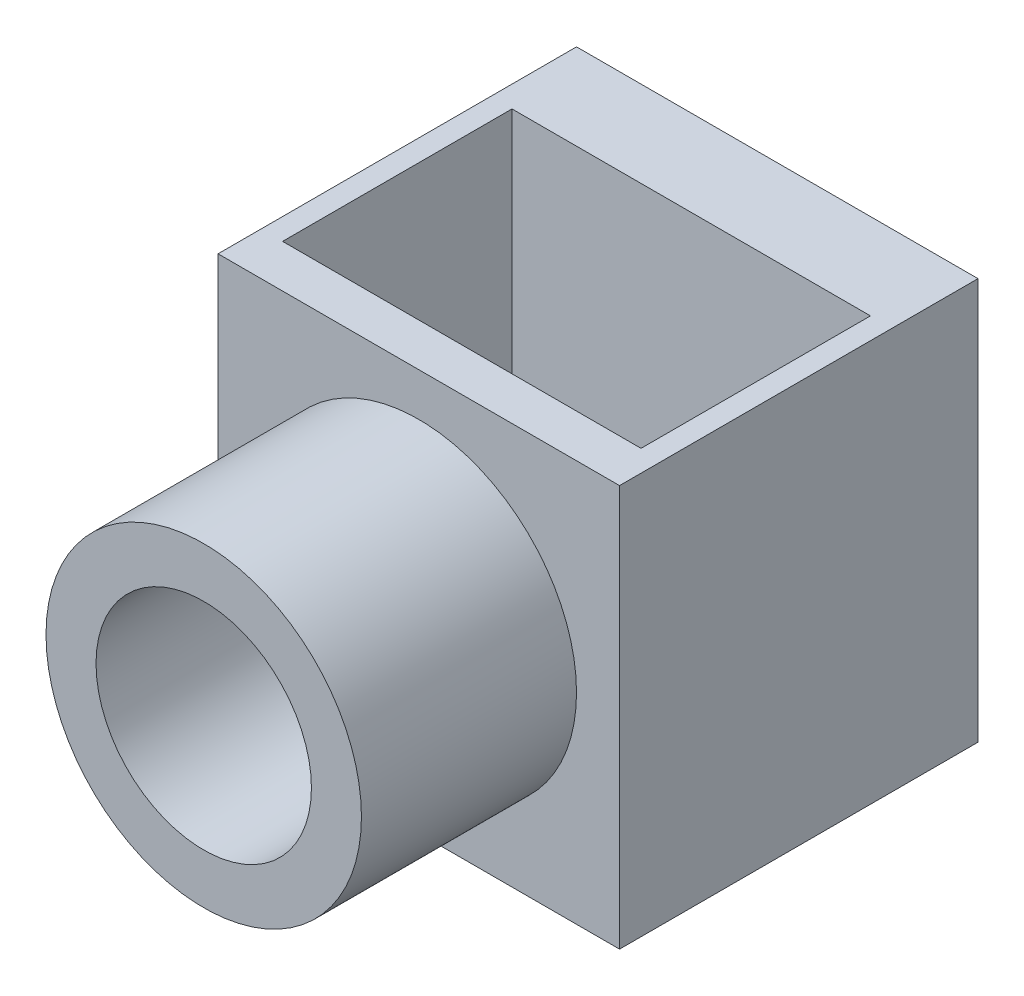
ISO-10303-21;
HEADER;
FILE_DESCRIPTION(('STEP AP214'),'2;1');
FILE_NAME('part.step','',(''),(''),'','','');
FILE_SCHEMA(('AUTOMOTIVE_DESIGN { 1 0 10303 214 1 1 1 1 }'));
ENDSEC;
DATA;
#1=APPLICATION_CONTEXT('core data for automotive mechanical design processes');
#2=APPLICATION_PROTOCOL_DEFINITION('international standard','automotive_design',2000,#1);
#3=PRODUCT_CONTEXT('',#1,'mechanical');
#4=PRODUCT('Part','Part','',(#3));
#5=PRODUCT_RELATED_PRODUCT_CATEGORY('part','',(#4));
#6=PRODUCT_DEFINITION_FORMATION('','',#4);
#7=PRODUCT_DEFINITION_CONTEXT('part definition',#1,'design');
#8=PRODUCT_DEFINITION('design','',#6,#7);
#9=PRODUCT_DEFINITION_SHAPE('','',#8);
#10=(LENGTH_UNIT() NAMED_UNIT(*) SI_UNIT(.MILLI.,.METRE.));
#11=(NAMED_UNIT(*) PLANE_ANGLE_UNIT() SI_UNIT($,.RADIAN.));
#12=(NAMED_UNIT(*) SI_UNIT($,.STERADIAN.) SOLID_ANGLE_UNIT());
#13=UNCERTAINTY_MEASURE_WITH_UNIT(LENGTH_MEASURE(1.E-05),#10,'distance_accuracy_value','');
#14=(GEOMETRIC_REPRESENTATION_CONTEXT(3) GLOBAL_UNCERTAINTY_ASSIGNED_CONTEXT((#13)) GLOBAL_UNIT_ASSIGNED_CONTEXT((#10,
#11,#12)) REPRESENTATION_CONTEXT('',''));
#15=CARTESIAN_POINT('',(0.,0.,0.));
#16=DIRECTION('',(0.,0.,1.));
#17=DIRECTION('',(1.,0.,0.));
#18=AXIS2_PLACEMENT_3D('',#15,#16,#17);
#19=CARTESIAN_POINT('',(0.,7.112,0.));
#20=DIRECTION('',(1.,0.,0.));
#21=DIRECTION('',(0.,0.,-1.));
#22=AXIS2_PLACEMENT_3D('',#19,#20,#21);
#23=PLANE('',#22);
#24=DIRECTION('',(0.,0.,1.));
#25=VECTOR('',#24,1.);
#26=CARTESIAN_POINT('',(0.,0.,0.));
#27=LINE('',#26,#25);
#28=CARTESIAN_POINT('',(0.,0.,-6.35));
#29=VERTEX_POINT('',#28);
#30=CARTESIAN_POINT('',(0.,0.,0.));
#31=VERTEX_POINT('',#30);
#32=EDGE_CURVE('E159',#29,#31,#27,.T.);
#33=ORIENTED_EDGE('',*,*,#32,.T.);
#34=DIRECTION('',(0.,-1.,0.));
#35=VECTOR('',#34,1.);
#36=CARTESIAN_POINT('',(0.,7.112,0.));
#37=LINE('',#36,#35);
#38=CARTESIAN_POINT('',(0.,7.112,0.));
#39=VERTEX_POINT('',#38);
#40=EDGE_CURVE('E42',#39,#31,#37,.T.);
#41=ORIENTED_EDGE('',*,*,#40,.F.);
#42=DIRECTION('',(0.,0.,1.));
#43=VECTOR('',#42,1.);
#44=CARTESIAN_POINT('',(0.,7.112,0.));
#45=LINE('',#44,#43);
#46=CARTESIAN_POINT('',(0.,7.112,-6.35));
#47=VERTEX_POINT('',#46);
#48=EDGE_CURVE('E152',#47,#39,#45,.T.);
#49=ORIENTED_EDGE('',*,*,#48,.F.);
#50=DIRECTION('',(0.,-1.,0.));
#51=VECTOR('',#50,1.);
#52=CARTESIAN_POINT('',(0.,7.112,-6.35));
#53=LINE('',#52,#51);
#54=EDGE_CURVE('E158',#47,#29,#53,.T.);
#55=ORIENTED_EDGE('',*,*,#54,.T.);
#56=EDGE_LOOP('',(#33,#41,#49,#55));
#57=FACE_BOUND('',#56,.T.);
#58=ADVANCED_FACE('F35',(#57),#23,.F.);
#59=CARTESIAN_POINT('',(0.,7.112,0.));
#60=DIRECTION('',(0.,0.,-1.));
#61=DIRECTION('',(-1.,0.,0.));
#62=AXIS2_PLACEMENT_3D('',#59,#60,#61);
#63=PLANE('',#62);
#64=CARTESIAN_POINT('',(3.556,3.556,0.));
#65=DIRECTION('',(0.,0.,-1.));
#66=DIRECTION('',(-1.,0.,0.));
#67=AXIS2_PLACEMENT_3D('',#64,#65,#66);
#68=CIRCLE('',#67,2.794);
#69=CARTESIAN_POINT('',(0.762000000000001,3.556,0.));
#70=VERTEX_POINT('',#69);
#71=EDGE_CURVE('E11',#70,#70,#68,.F.);
#72=ORIENTED_EDGE('',*,*,#71,.F.);
#73=EDGE_LOOP('',(#72));
#74=FACE_BOUND('',#73,.T.);
#75=DIRECTION('',(1.,0.,0.));
#76=VECTOR('',#75,1.);
#77=CARTESIAN_POINT('',(0.,0.,0.));
#78=LINE('',#77,#76);
#79=CARTESIAN_POINT('',(7.112,0.,0.));
#80=VERTEX_POINT('',#79);
#81=EDGE_CURVE('E162',#31,#80,#78,.T.);
#82=ORIENTED_EDGE('',*,*,#81,.T.);
#83=DIRECTION('',(0.,-1.,0.));
#84=VECTOR('',#83,1.);
#85=CARTESIAN_POINT('',(7.112,7.112,0.));
#86=LINE('',#85,#84);
#87=CARTESIAN_POINT('',(7.112,7.112,0.));
#88=VERTEX_POINT('',#87);
#89=EDGE_CURVE('E170',#88,#80,#86,.T.);
#90=ORIENTED_EDGE('',*,*,#89,.F.);
#91=DIRECTION('',(1.,0.,0.));
#92=VECTOR('',#91,1.);
#93=CARTESIAN_POINT('',(0.,7.112,0.));
#94=LINE('',#93,#92);
#95=EDGE_CURVE('E87',#39,#88,#94,.T.);
#96=ORIENTED_EDGE('',*,*,#95,.F.);
#97=ORIENTED_EDGE('',*,*,#40,.T.);
#98=EDGE_LOOP('',(#82,#90,#96,#97));
#99=FACE_BOUND('',#98,.T.);
#100=ADVANCED_FACE('F192',(#74,#99),#63,.F.);
#101=CARTESIAN_POINT('',(7.112,7.112,0.));
#102=DIRECTION('',(-1.,0.,0.));
#103=DIRECTION('',(0.,0.,1.));
#104=AXIS2_PLACEMENT_3D('',#101,#102,#103);
#105=PLANE('',#104);
#106=DIRECTION('',(0.,0.,-1.));
#107=VECTOR('',#106,1.);
#108=CARTESIAN_POINT('',(7.112,0.,0.));
#109=LINE('',#108,#107);
#110=CARTESIAN_POINT('',(7.112,0.,-6.35));
#111=VERTEX_POINT('',#110);
#112=EDGE_CURVE('E164',#80,#111,#109,.T.);
#113=ORIENTED_EDGE('',*,*,#112,.T.);
#114=DIRECTION('',(0.,-1.,0.));
#115=VECTOR('',#114,1.);
#116=CARTESIAN_POINT('',(7.112,7.112,-6.35));
#117=LINE('',#116,#115);
#118=CARTESIAN_POINT('',(7.112,7.112,-6.35));
#119=VERTEX_POINT('',#118);
#120=EDGE_CURVE('E168',#119,#111,#117,.T.);
#121=ORIENTED_EDGE('',*,*,#120,.F.);
#122=DIRECTION('',(0.,0.,-1.));
#123=VECTOR('',#122,1.);
#124=CARTESIAN_POINT('',(7.112,7.112,0.));
#125=LINE('',#124,#123);
#126=EDGE_CURVE('E155',#88,#119,#125,.T.);
#127=ORIENTED_EDGE('',*,*,#126,.F.);
#128=ORIENTED_EDGE('',*,*,#89,.T.);
#129=EDGE_LOOP('',(#113,#121,#127,#128));
#130=FACE_BOUND('',#129,.T.);
#131=ADVANCED_FACE('F197',(#130),#105,.F.);
#132=CARTESIAN_POINT('',(0.,7.112,-6.35));
#133=DIRECTION('',(0.,0.,1.));
#134=DIRECTION('',(1.,0.,0.));
#135=AXIS2_PLACEMENT_3D('',#132,#133,#134);
#136=PLANE('',#135);
#137=DIRECTION('',(-1.,0.,0.));
#138=VECTOR('',#137,1.);
#139=CARTESIAN_POINT('',(0.,0.,-6.35));
#140=LINE('',#139,#138);
#141=EDGE_CURVE('E79',#111,#29,#140,.T.);
#142=ORIENTED_EDGE('',*,*,#141,.T.);
#143=ORIENTED_EDGE('',*,*,#54,.F.);
#144=DIRECTION('',(-1.,0.,0.));
#145=VECTOR('',#144,1.);
#146=CARTESIAN_POINT('',(0.,7.112,-6.35));
#147=LINE('',#146,#145);
#148=EDGE_CURVE('E58',#119,#47,#147,.T.);
#149=ORIENTED_EDGE('',*,*,#148,.F.);
#150=ORIENTED_EDGE('',*,*,#120,.T.);
#151=EDGE_LOOP('',(#142,#143,#149,#150));
#152=FACE_BOUND('',#151,.T.);
#153=ADVANCED_FACE('F209',(#152),#136,.F.);
#154=CARTESIAN_POINT('',(0.,7.112,0.));
#155=DIRECTION('',(0.,-1.,0.));
#156=DIRECTION('',(0.,0.,-1.));
#157=AXIS2_PLACEMENT_3D('',#154,#155,#156);
#158=PLANE('',#157);
#159=DIRECTION('',(0.,0.,1.));
#160=VECTOR('',#159,1.);
#161=CARTESIAN_POINT('',(6.731,7.112,-4.826));
#162=LINE('',#161,#160);
#163=CARTESIAN_POINT('',(6.731,7.112,-4.826));
#164=VERTEX_POINT('',#163);
#165=CARTESIAN_POINT('',(6.731,7.112,-0.762));
#166=VERTEX_POINT('',#165);
#167=EDGE_CURVE('E142',#164,#166,#162,.T.);
#168=ORIENTED_EDGE('',*,*,#167,.T.);
#169=DIRECTION('',(1.,0.,0.));
#170=VECTOR('',#169,1.);
#171=CARTESIAN_POINT('',(0.381000000000001,7.112,-0.762));
#172=LINE('',#171,#170);
#173=CARTESIAN_POINT('',(0.381000000000001,7.112,-0.762));
#174=VERTEX_POINT('',#173);
#175=EDGE_CURVE('E49',#174,#166,#172,.T.);
#176=ORIENTED_EDGE('',*,*,#175,.F.);
#177=DIRECTION('',(0.,0.,1.));
#178=VECTOR('',#177,1.);
#179=CARTESIAN_POINT('',(0.381,7.112,-4.826));
#180=LINE('',#179,#178);
#181=CARTESIAN_POINT('',(0.381,7.112,-4.826));
#182=VERTEX_POINT('',#181);
#183=EDGE_CURVE('E130',#182,#174,#180,.T.);
#184=ORIENTED_EDGE('',*,*,#183,.F.);
#185=DIRECTION('',(1.,0.,0.));
#186=VECTOR('',#185,1.);
#187=CARTESIAN_POINT('',(0.381,7.112,-4.826));
#188=LINE('',#187,#186);
#189=EDGE_CURVE('E133',#182,#164,#188,.T.);
#190=ORIENTED_EDGE('',*,*,#189,.T.);
#191=EDGE_LOOP('',(#168,#176,#184,#190));
#192=FACE_BOUND('',#191,.T.);
#193=ORIENTED_EDGE('',*,*,#48,.T.);
#194=ORIENTED_EDGE('',*,*,#95,.T.);
#195=ORIENTED_EDGE('',*,*,#126,.T.);
#196=ORIENTED_EDGE('',*,*,#148,.T.);
#197=EDGE_LOOP('',(#193,#194,#195,#196));
#198=FACE_BOUND('',#197,.T.);
#199=ADVANCED_FACE('F207',(#192,#198),#158,.F.);
#200=CARTESIAN_POINT('',(0.,0.,0.));
#201=DIRECTION('',(0.,-1.,0.));
#202=DIRECTION('',(0.,0.,-1.));
#203=AXIS2_PLACEMENT_3D('',#200,#201,#202);
#204=PLANE('',#203);
#205=ORIENTED_EDGE('',*,*,#32,.F.);
#206=ORIENTED_EDGE('',*,*,#141,.F.);
#207=ORIENTED_EDGE('',*,*,#112,.F.);
#208=ORIENTED_EDGE('',*,*,#81,.F.);
#209=EDGE_LOOP('',(#205,#206,#207,#208));
#210=FACE_BOUND('',#209,.T.);
#211=ADVANCED_FACE('F188',(#210),#204,.T.);
#212=CARTESIAN_POINT('',(3.556,3.556,-1.27));
#213=DIRECTION('',(0.,0.,1.));
#214=DIRECTION('',(1.,0.,0.));
#215=AXIS2_PLACEMENT_3D('',#212,#213,#214);
#216=CYLINDRICAL_SURFACE('',#215,2.286);
#217=CARTESIAN_POINT('',(3.556,3.556,-0.762));
#218=DIRECTION('',(0.,0.,1.));
#219=DIRECTION('',(1.,0.,0.));
#220=AXIS2_PLACEMENT_3D('',#217,#218,#219);
#221=CIRCLE('',#220,2.286);
#222=CARTESIAN_POINT('',(5.842,3.556,-0.762));
#223=VERTEX_POINT('',#222);
#224=EDGE_CURVE('E148',#223,#223,#221,.F.);
#225=ORIENTED_EDGE('',*,*,#224,.T.);
#226=EDGE_LOOP('',(#225));
#227=FACE_BOUND('',#226,.T.);
#228=CARTESIAN_POINT('',(3.556,3.556,0.));
#229=DIRECTION('',(0.,0.,1.));
#230=DIRECTION('',(1.,0.,0.));
#231=AXIS2_PLACEMENT_3D('',#228,#229,#230);
#232=CIRCLE('',#231,2.286);
#233=CARTESIAN_POINT('',(5.842,3.556,0.));
#234=VERTEX_POINT('',#233);
#235=EDGE_CURVE('E136',#234,#234,#232,.F.);
#236=ORIENTED_EDGE('',*,*,#235,.F.);
#237=EDGE_LOOP('',(#236));
#238=FACE_BOUND('',#237,.T.);
#239=ADVANCED_FACE('F176',(#227,#238),#216,.F.);
#240=CARTESIAN_POINT('',(0.381000000000001,0.762000000000001,-0.762));
#241=DIRECTION('',(0.,0.,1.));
#242=DIRECTION('',(1.,0.,0.));
#243=AXIS2_PLACEMENT_3D('',#240,#241,#242);
#244=PLANE('',#243);
#245=ORIENTED_EDGE('',*,*,#175,.T.);
#246=DIRECTION('',(0.,1.,0.));
#247=VECTOR('',#246,1.);
#248=CARTESIAN_POINT('',(6.731,0.762000000000001,-0.762));
#249=LINE('',#248,#247);
#250=CARTESIAN_POINT('',(6.731,0.762000000000001,-0.762));
#251=VERTEX_POINT('',#250);
#252=EDGE_CURVE('E113',#251,#166,#249,.T.);
#253=ORIENTED_EDGE('',*,*,#252,.F.);
#254=DIRECTION('',(1.,0.,0.));
#255=VECTOR('',#254,1.);
#256=CARTESIAN_POINT('',(0.381000000000001,0.762000000000001,-0.762));
#257=LINE('',#256,#255);
#258=CARTESIAN_POINT('',(0.381000000000001,0.762000000000001,-0.762));
#259=VERTEX_POINT('',#258);
#260=EDGE_CURVE('E120',#259,#251,#257,.T.);
#261=ORIENTED_EDGE('',*,*,#260,.F.);
#262=DIRECTION('',(0.,1.,0.));
#263=VECTOR('',#262,1.);
#264=CARTESIAN_POINT('',(0.381000000000001,0.762000000000001,-0.762));
#265=LINE('',#264,#263);
#266=EDGE_CURVE('E146',#259,#174,#265,.T.);
#267=ORIENTED_EDGE('',*,*,#266,.T.);
#268=EDGE_LOOP('',(#245,#253,#261,#267));
#269=FACE_BOUND('',#268,.T.);
#270=ORIENTED_EDGE('',*,*,#224,.F.);
#271=EDGE_LOOP('',(#270));
#272=FACE_BOUND('',#271,.T.);
#273=ADVANCED_FACE('F123',(#269,#272),#244,.F.);
#274=CARTESIAN_POINT('',(0.381,0.762000000000001,-4.826));
#275=DIRECTION('',(-1.,0.,0.));
#276=DIRECTION('',(0.,0.,1.));
#277=AXIS2_PLACEMENT_3D('',#274,#275,#276);
#278=PLANE('',#277);
#279=ORIENTED_EDGE('',*,*,#183,.T.);
#280=ORIENTED_EDGE('',*,*,#266,.F.);
#281=DIRECTION('',(0.,0.,1.));
#282=VECTOR('',#281,1.);
#283=CARTESIAN_POINT('',(0.381,0.762000000000001,-4.826));
#284=LINE('',#283,#282);
#285=CARTESIAN_POINT('',(0.381,0.762000000000001,-4.826));
#286=VERTEX_POINT('',#285);
#287=EDGE_CURVE('E126',#286,#259,#284,.T.);
#288=ORIENTED_EDGE('',*,*,#287,.F.);
#289=DIRECTION('',(0.,1.,0.));
#290=VECTOR('',#289,1.);
#291=CARTESIAN_POINT('',(0.381,0.762000000000001,-4.826));
#292=LINE('',#291,#290);
#293=EDGE_CURVE('E149',#286,#182,#292,.T.);
#294=ORIENTED_EDGE('',*,*,#293,.T.);
#295=EDGE_LOOP('',(#279,#280,#288,#294));
#296=FACE_BOUND('',#295,.T.);
#297=ADVANCED_FACE('F179',(#296),#278,.F.);
#298=CARTESIAN_POINT('',(0.381,0.762000000000001,-4.826));
#299=DIRECTION('',(0.,0.,1.));
#300=DIRECTION('',(1.,0.,0.));
#301=AXIS2_PLACEMENT_3D('',#298,#299,#300);
#302=PLANE('',#301);
#303=ORIENTED_EDGE('',*,*,#189,.F.);
#304=ORIENTED_EDGE('',*,*,#293,.F.);
#305=DIRECTION('',(1.,0.,0.));
#306=VECTOR('',#305,1.);
#307=CARTESIAN_POINT('',(0.381,0.762000000000001,-4.826));
#308=LINE('',#307,#306);
#309=CARTESIAN_POINT('',(6.731,0.762000000000001,-4.826));
#310=VERTEX_POINT('',#309);
#311=EDGE_CURVE('E119',#286,#310,#308,.T.);
#312=ORIENTED_EDGE('',*,*,#311,.T.);
#313=DIRECTION('',(0.,1.,0.));
#314=VECTOR('',#313,1.);
#315=CARTESIAN_POINT('',(6.731,0.762000000000001,-4.826));
#316=LINE('',#315,#314);
#317=EDGE_CURVE('E115',#310,#164,#316,.T.);
#318=ORIENTED_EDGE('',*,*,#317,.T.);
#319=EDGE_LOOP('',(#303,#304,#312,#318));
#320=FACE_BOUND('',#319,.T.);
#321=ADVANCED_FACE('F185',(#320),#302,.T.);
#322=CARTESIAN_POINT('',(6.731,0.762000000000001,-4.826));
#323=DIRECTION('',(-1.,0.,0.));
#324=DIRECTION('',(0.,0.,1.));
#325=AXIS2_PLACEMENT_3D('',#322,#323,#324);
#326=PLANE('',#325);
#327=ORIENTED_EDGE('',*,*,#167,.F.);
#328=ORIENTED_EDGE('',*,*,#317,.F.);
#329=DIRECTION('',(0.,0.,1.));
#330=VECTOR('',#329,1.);
#331=CARTESIAN_POINT('',(6.731,0.762000000000001,-4.826));
#332=LINE('',#331,#330);
#333=EDGE_CURVE('E110',#310,#251,#332,.T.);
#334=ORIENTED_EDGE('',*,*,#333,.T.);
#335=ORIENTED_EDGE('',*,*,#252,.T.);
#336=EDGE_LOOP('',(#327,#328,#334,#335));
#337=FACE_BOUND('',#336,.T.);
#338=ADVANCED_FACE('F112',(#337),#326,.T.);
#339=CARTESIAN_POINT('',(0.,0.762000000000001,0.));
#340=DIRECTION('',(0.,-1.,0.));
#341=DIRECTION('',(0.,0.,-1.));
#342=AXIS2_PLACEMENT_3D('',#339,#340,#341);
#343=PLANE('',#342);
#344=ORIENTED_EDGE('',*,*,#260,.T.);
#345=ORIENTED_EDGE('',*,*,#333,.F.);
#346=ORIENTED_EDGE('',*,*,#311,.F.);
#347=ORIENTED_EDGE('',*,*,#287,.T.);
#348=EDGE_LOOP('',(#344,#345,#346,#347));
#349=FACE_BOUND('',#348,.T.);
#350=ADVANCED_FACE('F128',(#349),#343,.F.);
#351=CARTESIAN_POINT('',(3.556,3.556,0.));
#352=DIRECTION('',(0.,0.,1.));
#353=DIRECTION('',(1.,0.,0.));
#354=AXIS2_PLACEMENT_3D('',#351,#352,#353);
#355=PLANE('',#354);
#356=CARTESIAN_POINT('',(3.556,3.556,0.));
#357=DIRECTION('',(0.,0.,1.));
#358=DIRECTION('',(1.,0.,0.));
#359=AXIS2_PLACEMENT_3D('',#356,#357,#358);
#360=CIRCLE('',#359,1.90798007202286);
#361=CARTESIAN_POINT('',(5.46398007202286,3.556,0.));
#362=VERTEX_POINT('',#361);
#363=EDGE_CURVE('E330',#362,#362,#360,.T.);
#364=ORIENTED_EDGE('',*,*,#363,.T.);
#365=EDGE_LOOP('',(#364));
#366=FACE_BOUND('',#365,.T.);
#367=ORIENTED_EDGE('',*,*,#235,.T.);
#368=EDGE_LOOP('',(#367));
#369=FACE_BOUND('',#368,.T.);
#370=ADVANCED_FACE('F278',(#366,#369),#355,.F.);
#371=CARTESIAN_POINT('',(3.556,3.556,3.81));
#372=DIRECTION('',(0.,0.,-1.));
#373=DIRECTION('',(-1.,0.,0.));
#374=AXIS2_PLACEMENT_3D('',#371,#372,#373);
#375=CYLINDRICAL_SURFACE('',#374,2.794);
#376=CARTESIAN_POINT('',(3.556,3.556,3.81));
#377=DIRECTION('',(0.,0.,1.));
#378=DIRECTION('',(1.,0.,0.));
#379=AXIS2_PLACEMENT_3D('',#376,#377,#378);
#380=CIRCLE('',#379,2.794);
#381=CARTESIAN_POINT('',(0.762000000000001,3.556,3.81));
#382=VERTEX_POINT('',#381);
#383=EDGE_CURVE('E335',#382,#382,#380,.T.);
#384=CARTESIAN_POINT('',(0.762000000000001,3.556,3.81));
#385=CARTESIAN_POINT('',(0.762000000000001,3.556,3.7703125));
#386=CARTESIAN_POINT('',(0.762000000000001,3.556,3.730625));
#387=CARTESIAN_POINT('',(0.762000000000001,3.556,3.65125));
#388=CARTESIAN_POINT('',(0.762000000000001,3.556,3.6115625));
#389=CARTESIAN_POINT('',(0.762000000000001,3.556,3.5321875));
#390=CARTESIAN_POINT('',(0.762000000000001,3.556,3.4925));
#391=CARTESIAN_POINT('',(0.762000000000001,3.556,3.413125));
#392=CARTESIAN_POINT('',(0.762000000000001,3.556,3.3734375));
#393=CARTESIAN_POINT('',(0.762000000000001,3.556,3.2940625));
#394=CARTESIAN_POINT('',(0.762000000000001,3.556,3.254375));
#395=CARTESIAN_POINT('',(0.762000000000001,3.556,3.175));
#396=CARTESIAN_POINT('',(0.762000000000001,3.556,3.1353125));
#397=CARTESIAN_POINT('',(0.762000000000001,3.556,3.0559375));
#398=CARTESIAN_POINT('',(0.762000000000001,3.556,3.01625));
#399=CARTESIAN_POINT('',(0.762000000000001,3.556,2.936875));
#400=CARTESIAN_POINT('',(0.762000000000001,3.556,2.8971875));
#401=CARTESIAN_POINT('',(0.762000000000001,3.556,2.8178125));
#402=CARTESIAN_POINT('',(0.762000000000001,3.556,2.778125));
#403=CARTESIAN_POINT('',(0.762000000000001,3.556,2.69875));
#404=CARTESIAN_POINT('',(0.762000000000001,3.556,2.6590625));
#405=CARTESIAN_POINT('',(0.762000000000001,3.556,2.5796875));
#406=CARTESIAN_POINT('',(0.762000000000001,3.556,2.54));
#407=CARTESIAN_POINT('',(0.762000000000001,3.556,2.460625));
#408=CARTESIAN_POINT('',(0.762000000000001,3.556,2.4209375));
#409=CARTESIAN_POINT('',(0.762000000000001,3.556,2.3415625));
#410=CARTESIAN_POINT('',(0.762000000000001,3.556,2.301875));
#411=CARTESIAN_POINT('',(0.762000000000001,3.556,2.2225));
#412=CARTESIAN_POINT('',(0.762000000000001,3.556,2.1828125));
#413=CARTESIAN_POINT('',(0.762000000000001,3.556,2.1034375));
#414=CARTESIAN_POINT('',(0.762000000000001,3.556,2.06375));
#415=CARTESIAN_POINT('',(0.762000000000001,3.556,1.984375));
#416=CARTESIAN_POINT('',(0.762000000000001,3.556,1.9446875));
#417=CARTESIAN_POINT('',(0.762000000000001,3.556,1.8653125));
#418=CARTESIAN_POINT('',(0.762000000000001,3.556,1.825625));
#419=CARTESIAN_POINT('',(0.762000000000001,3.556,1.74625));
#420=CARTESIAN_POINT('',(0.762000000000001,3.556,1.7065625));
#421=CARTESIAN_POINT('',(0.762000000000001,3.556,1.6271875));
#422=CARTESIAN_POINT('',(0.762000000000001,3.556,1.5875));
#423=CARTESIAN_POINT('',(0.762000000000001,3.556,1.508125));
#424=CARTESIAN_POINT('',(0.762000000000001,3.556,1.4684375));
#425=CARTESIAN_POINT('',(0.762000000000001,3.556,1.3890625));
#426=CARTESIAN_POINT('',(0.762000000000001,3.556,1.349375));
#427=CARTESIAN_POINT('',(0.762000000000001,3.556,1.27));
#428=CARTESIAN_POINT('',(0.762000000000001,3.556,1.2303125));
#429=CARTESIAN_POINT('',(0.762000000000001,3.556,1.1509375));
#430=CARTESIAN_POINT('',(0.762000000000001,3.556,1.11125));
#431=CARTESIAN_POINT('',(0.762000000000001,3.556,1.031875));
#432=CARTESIAN_POINT('',(0.762000000000001,3.556,0.9921875));
#433=CARTESIAN_POINT('',(0.762000000000001,3.556,0.9128125));
#434=CARTESIAN_POINT('',(0.762000000000001,3.556,0.873125));
#435=CARTESIAN_POINT('',(0.762000000000001,3.556,0.79375));
#436=CARTESIAN_POINT('',(0.762000000000001,3.556,0.7540625));
#437=CARTESIAN_POINT('',(0.762000000000001,3.556,0.6746875));
#438=CARTESIAN_POINT('',(0.762000000000001,3.556,0.635));
#439=CARTESIAN_POINT('',(0.762000000000001,3.556,0.555625));
#440=CARTESIAN_POINT('',(0.762000000000001,3.556,0.5159375));
#441=CARTESIAN_POINT('',(0.762000000000001,3.556,0.4365625));
#442=CARTESIAN_POINT('',(0.762000000000001,3.556,0.396875));
#443=CARTESIAN_POINT('',(0.762000000000001,3.556,0.3175));
#444=CARTESIAN_POINT('',(0.762000000000001,3.556,0.2778125));
#445=CARTESIAN_POINT('',(0.762000000000001,3.556,0.1984375));
#446=CARTESIAN_POINT('',(0.762000000000001,3.556,0.15875));
#447=CARTESIAN_POINT('',(0.762000000000001,3.556,0.0793749999999999));
#448=CARTESIAN_POINT('',(0.762000000000001,3.556,0.0396874999999999));
#449=CARTESIAN_POINT('',(0.762000000000001,3.556,0.));
#450=B_SPLINE_CURVE_WITH_KNOTS('',3,(#384,#385,#386,#387,#388,#389,#390,#391,#392,#393,#394,
#395,#396,#397,#398,#399,#400,#401,#402,#403,#404,#405,#406,#407,#408,#409,#410,#411,#412,#413,
#414,#415,#416,#417,#418,#419,#420,#421,#422,#423,#424,#425,#426,#427,#428,#429,#430,#431,#432,
#433,#434,#435,#436,#437,#438,#439,#440,#441,#442,#443,#444,#445,#446,#447,#448,#449),
.UNSPECIFIED.,.F.,.F.,(4,2,2,2,2,2,2,2,2,2,2,2,2,2,2,2,2,2,2,2,2,2,2,2,2,2,2,2,2,2,2,2,4),(0.,
0.1190625,0.238125,0.3571875,0.47625,0.5953125,0.714375,0.8334375,0.9525,1.0715625,1.190625,
1.3096875,1.42875,1.5478125,1.666875,1.7859375,1.905,2.0240625,2.143125,2.2621875,2.38125,
2.5003125,2.619375,2.7384375,2.8575,2.9765625,3.095625,3.2146875,3.33375,3.4528125,3.571875,
3.6909375,3.81),.UNSPECIFIED.);
#451=EDGE_CURVE('BSEAM291',#382,#70,#450,.T.);
#452=ORIENTED_EDGE('',*,*,#383,.F.);
#453=ORIENTED_EDGE('',*,*,#71,.T.);
#454=ORIENTED_EDGE('',*,*,#451,.T.);
#455=ORIENTED_EDGE('',*,*,#451,.F.);
#456=EDGE_LOOP('',(#452,#454,#453,#455));
#457=FACE_BOUND('',#456,.T.);
#458=ADVANCED_FACE('F291',(#457),#375,.T.);
#459=CARTESIAN_POINT('',(3.556,3.556,3.81));
#460=DIRECTION('',(0.,0.,1.));
#461=DIRECTION('',(1.,0.,0.));
#462=AXIS2_PLACEMENT_3D('',#459,#460,#461);
#463=PLANE('',#462);
#464=CARTESIAN_POINT('',(3.556,3.556,3.81));
#465=DIRECTION('',(0.,0.,1.));
#466=DIRECTION('',(1.,0.,0.));
#467=AXIS2_PLACEMENT_3D('',#464,#465,#466);
#468=CIRCLE('',#467,1.90798007202286);
#469=CARTESIAN_POINT('',(5.46398007202286,3.556,3.81));
#470=VERTEX_POINT('',#469);
#471=EDGE_CURVE('E333',#470,#470,#468,.T.);
#472=ORIENTED_EDGE('',*,*,#471,.F.);
#473=EDGE_LOOP('',(#472));
#474=FACE_BOUND('',#473,.T.);
#475=ORIENTED_EDGE('',*,*,#383,.T.);
#476=EDGE_LOOP('',(#475));
#477=FACE_BOUND('',#476,.T.);
#478=ADVANCED_FACE('F296',(#474,#477),#463,.T.);
#479=CARTESIAN_POINT('',(3.556,3.556,0.));
#480=DIRECTION('',(0.,0.,1.));
#481=DIRECTION('',(1.,0.,0.));
#482=AXIS2_PLACEMENT_3D('',#479,#480,#481);
#483=CYLINDRICAL_SURFACE('',#482,1.90798007202286);
#484=CARTESIAN_POINT('',(5.46398007202286,3.556,0.));
#485=CARTESIAN_POINT('',(5.46398007202286,3.556,0.0396874999999999));
#486=CARTESIAN_POINT('',(5.46398007202286,3.556,0.079375));
#487=CARTESIAN_POINT('',(5.46398007202286,3.556,0.15875));
#488=CARTESIAN_POINT('',(5.46398007202286,3.556,0.1984375));
#489=CARTESIAN_POINT('',(5.46398007202286,3.556,0.2778125));
#490=CARTESIAN_POINT('',(5.46398007202286,3.556,0.3175));
#491=CARTESIAN_POINT('',(5.46398007202286,3.556,0.396875));
#492=CARTESIAN_POINT('',(5.46398007202286,3.556,0.4365625));
#493=CARTESIAN_POINT('',(5.46398007202286,3.556,0.5159375));
#494=CARTESIAN_POINT('',(5.46398007202286,3.556,0.555625));
#495=CARTESIAN_POINT('',(5.46398007202286,3.556,0.635));
#496=CARTESIAN_POINT('',(5.46398007202286,3.556,0.6746875));
#497=CARTESIAN_POINT('',(5.46398007202286,3.556,0.7540625));
#498=CARTESIAN_POINT('',(5.46398007202286,3.556,0.79375));
#499=CARTESIAN_POINT('',(5.46398007202286,3.556,0.873125));
#500=CARTESIAN_POINT('',(5.46398007202286,3.556,0.9128125));
#501=CARTESIAN_POINT('',(5.46398007202286,3.556,0.9921875));
#502=CARTESIAN_POINT('',(5.46398007202286,3.556,1.031875));
#503=CARTESIAN_POINT('',(5.46398007202286,3.556,1.11125));
#504=CARTESIAN_POINT('',(5.46398007202286,3.556,1.1509375));
#505=CARTESIAN_POINT('',(5.46398007202286,3.556,1.2303125));
#506=CARTESIAN_POINT('',(5.46398007202286,3.556,1.27));
#507=CARTESIAN_POINT('',(5.46398007202286,3.556,1.349375));
#508=CARTESIAN_POINT('',(5.46398007202286,3.556,1.3890625));
#509=CARTESIAN_POINT('',(5.46398007202286,3.556,1.4684375));
#510=CARTESIAN_POINT('',(5.46398007202286,3.556,1.508125));
#511=CARTESIAN_POINT('',(5.46398007202286,3.556,1.5875));
#512=CARTESIAN_POINT('',(5.46398007202286,3.556,1.6271875));
#513=CARTESIAN_POINT('',(5.46398007202286,3.556,1.7065625));
#514=CARTESIAN_POINT('',(5.46398007202286,3.556,1.74625));
#515=CARTESIAN_POINT('',(5.46398007202286,3.556,1.825625));
#516=CARTESIAN_POINT('',(5.46398007202286,3.556,1.8653125));
#517=CARTESIAN_POINT('',(5.46398007202286,3.556,1.9446875));
#518=CARTESIAN_POINT('',(5.46398007202286,3.556,1.984375));
#519=CARTESIAN_POINT('',(5.46398007202286,3.556,2.06375));
#520=CARTESIAN_POINT('',(5.46398007202286,3.556,2.1034375));
#521=CARTESIAN_POINT('',(5.46398007202286,3.556,2.1828125));
#522=CARTESIAN_POINT('',(5.46398007202286,3.556,2.2225));
#523=CARTESIAN_POINT('',(5.46398007202286,3.556,2.301875));
#524=CARTESIAN_POINT('',(5.46398007202286,3.556,2.3415625));
#525=CARTESIAN_POINT('',(5.46398007202286,3.556,2.4209375));
#526=CARTESIAN_POINT('',(5.46398007202286,3.556,2.460625));
#527=CARTESIAN_POINT('',(5.46398007202286,3.556,2.54));
#528=CARTESIAN_POINT('',(5.46398007202286,3.556,2.5796875));
#529=CARTESIAN_POINT('',(5.46398007202286,3.556,2.6590625));
#530=CARTESIAN_POINT('',(5.46398007202286,3.556,2.69875));
#531=CARTESIAN_POINT('',(5.46398007202286,3.556,2.778125));
#532=CARTESIAN_POINT('',(5.46398007202286,3.556,2.8178125));
#533=CARTESIAN_POINT('',(5.46398007202286,3.556,2.8971875));
#534=CARTESIAN_POINT('',(5.46398007202286,3.556,2.936875));
#535=CARTESIAN_POINT('',(5.46398007202286,3.556,3.01625));
#536=CARTESIAN_POINT('',(5.46398007202286,3.556,3.0559375));
#537=CARTESIAN_POINT('',(5.46398007202286,3.556,3.1353125));
#538=CARTESIAN_POINT('',(5.46398007202286,3.556,3.175));
#539=CARTESIAN_POINT('',(5.46398007202286,3.556,3.254375));
#540=CARTESIAN_POINT('',(5.46398007202286,3.556,3.2940625));
#541=CARTESIAN_POINT('',(5.46398007202286,3.556,3.3734375));
#542=CARTESIAN_POINT('',(5.46398007202286,3.556,3.413125));
#543=CARTESIAN_POINT('',(5.46398007202286,3.556,3.4925));
#544=CARTESIAN_POINT('',(5.46398007202286,3.556,3.5321875));
#545=CARTESIAN_POINT('',(5.46398007202286,3.556,3.6115625));
#546=CARTESIAN_POINT('',(5.46398007202286,3.556,3.65125));
#547=CARTESIAN_POINT('',(5.46398007202286,3.556,3.730625));
#548=CARTESIAN_POINT('',(5.46398007202286,3.556,3.7703125));
#549=CARTESIAN_POINT('',(5.46398007202286,3.556,3.81));
#550=B_SPLINE_CURVE_WITH_KNOTS('',3,(#484,#485,#486,#487,#488,#489,#490,#491,#492,#493,#494,
#495,#496,#497,#498,#499,#500,#501,#502,#503,#504,#505,#506,#507,#508,#509,#510,#511,#512,#513,
#514,#515,#516,#517,#518,#519,#520,#521,#522,#523,#524,#525,#526,#527,#528,#529,#530,#531,#532,
#533,#534,#535,#536,#537,#538,#539,#540,#541,#542,#543,#544,#545,#546,#547,#548,#549),
.UNSPECIFIED.,.F.,.F.,(4,2,2,2,2,2,2,2,2,2,2,2,2,2,2,2,2,2,2,2,2,2,2,2,2,2,2,2,2,2,2,2,4),(0.,
0.1190625,0.238125,0.3571875,0.47625,0.5953125,0.714375,0.8334375,0.9525,1.0715625,1.190625,
1.3096875,1.42875,1.5478125,1.666875,1.7859375,1.905,2.0240625,2.143125,2.2621875,2.38125,
2.5003125,2.619375,2.7384375,2.8575,2.9765625,3.095625,3.2146875,3.33375,3.4528125,3.571875,
3.6909375,3.81),.UNSPECIFIED.);
#551=EDGE_CURVE('BSEAM313',#362,#470,#550,.T.);
#552=ORIENTED_EDGE('',*,*,#363,.F.);
#553=ORIENTED_EDGE('',*,*,#471,.T.);
#554=ORIENTED_EDGE('',*,*,#551,.T.);
#555=ORIENTED_EDGE('',*,*,#551,.F.);
#556=EDGE_LOOP('',(#552,#554,#553,#555));
#557=FACE_BOUND('',#556,.T.);
#558=ADVANCED_FACE('F313',(#557),#483,.F.);
#559=CLOSED_SHELL('',(#58,#100,#131,#153,#199,#211,#239,#273,#297,#321,#338,#350,#370,#458,#478,#558));
#560=MANIFOLD_SOLID_BREP('B2',#559);
#561=ADVANCED_BREP_SHAPE_REPRESENTATION('',(#18,#560),#14);
#562=SHAPE_DEFINITION_REPRESENTATION(#9,#561);
ENDSEC;
END-ISO-10303-21;
